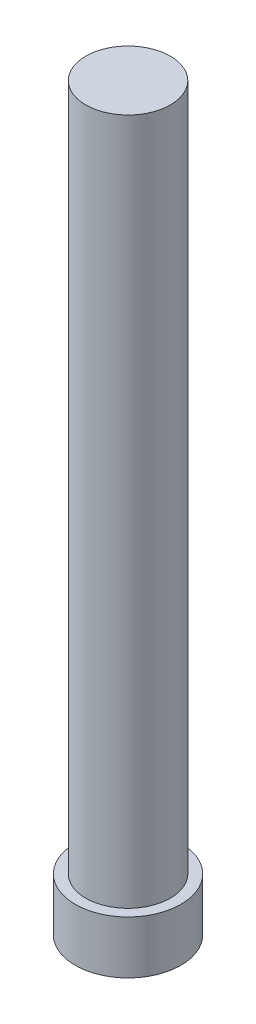
ISO-10303-21;
HEADER;
FILE_DESCRIPTION(('STEP AP214'),'2;1');
FILE_NAME('part.step','',(''),(''),'','','');
FILE_SCHEMA(('AUTOMOTIVE_DESIGN { 1 0 10303 214 1 1 1 1 }'));
ENDSEC;
DATA;
#1=APPLICATION_CONTEXT('core data for automotive mechanical design processes');
#2=APPLICATION_PROTOCOL_DEFINITION('international standard','automotive_design',2000,#1);
#3=PRODUCT_CONTEXT('',#1,'mechanical');
#4=PRODUCT('Part','Part','',(#3));
#5=PRODUCT_RELATED_PRODUCT_CATEGORY('part','',(#4));
#6=PRODUCT_DEFINITION_FORMATION('','',#4);
#7=PRODUCT_DEFINITION_CONTEXT('part definition',#1,'design');
#8=PRODUCT_DEFINITION('design','',#6,#7);
#9=PRODUCT_DEFINITION_SHAPE('','',#8);
#10=(LENGTH_UNIT() NAMED_UNIT(*) SI_UNIT(.MILLI.,.METRE.));
#11=(NAMED_UNIT(*) PLANE_ANGLE_UNIT() SI_UNIT($,.RADIAN.));
#12=(NAMED_UNIT(*) SI_UNIT($,.STERADIAN.) SOLID_ANGLE_UNIT());
#13=UNCERTAINTY_MEASURE_WITH_UNIT(LENGTH_MEASURE(1.E-05),#10,'distance_accuracy_value','');
#14=(GEOMETRIC_REPRESENTATION_CONTEXT(3) GLOBAL_UNCERTAINTY_ASSIGNED_CONTEXT((#13)) GLOBAL_UNIT_ASSIGNED_CONTEXT((#10,
#11,#12)) REPRESENTATION_CONTEXT('',''));
#15=CARTESIAN_POINT('',(0.,0.,0.));
#16=DIRECTION('',(0.,0.,1.));
#17=DIRECTION('',(1.,0.,0.));
#18=AXIS2_PLACEMENT_3D('',#15,#16,#17);
#19=CARTESIAN_POINT('',(0.,65.,0.));
#20=DIRECTION('',(0.,-1.,0.));
#21=DIRECTION('',(0.,0.,-1.));
#22=AXIS2_PLACEMENT_3D('',#19,#20,#21);
#23=CYLINDRICAL_SURFACE('',#22,4.);
#24=CARTESIAN_POINT('',(0.,65.,0.));
#25=DIRECTION('',(0.,1.,0.));
#26=DIRECTION('',(0.,0.,1.));
#27=AXIS2_PLACEMENT_3D('',#24,#25,#26);
#28=CIRCLE('',#27,4.);
#29=CARTESIAN_POINT('',(0.,65.,4.));
#30=VERTEX_POINT('',#29);
#31=EDGE_CURVE('E10',#30,#30,#28,.T.);
#32=ORIENTED_EDGE('',*,*,#31,.F.);
#33=EDGE_LOOP('',(#32));
#34=FACE_BOUND('',#33,.T.);
#35=CARTESIAN_POINT('',(0.,0.,0.));
#36=DIRECTION('',(0.,1.,0.));
#37=DIRECTION('',(0.,0.,1.));
#38=AXIS2_PLACEMENT_3D('',#35,#36,#37);
#39=CIRCLE('',#38,4.);
#40=CARTESIAN_POINT('',(0.,0.,4.));
#41=VERTEX_POINT('',#40);
#42=EDGE_CURVE('E38',#41,#41,#39,.T.);
#43=ORIENTED_EDGE('',*,*,#42,.T.);
#44=EDGE_LOOP('',(#43));
#45=FACE_BOUND('',#44,.T.);
#46=ADVANCED_FACE('F35',(#34,#45),#23,.T.);
#47=CARTESIAN_POINT('',(0.,65.,0.));
#48=DIRECTION('',(0.,1.,0.));
#49=DIRECTION('',(0.,0.,1.));
#50=AXIS2_PLACEMENT_3D('',#47,#48,#49);
#51=PLANE('',#50);
#52=ORIENTED_EDGE('',*,*,#31,.T.);
#53=EDGE_LOOP('',(#52));
#54=FACE_BOUND('',#53,.T.);
#55=ADVANCED_FACE('F58',(#54),#51,.T.);
#56=CARTESIAN_POINT('',(0.,-5.,0.));
#57=DIRECTION('',(0.,1.,0.));
#58=DIRECTION('',(0.,0.,1.));
#59=AXIS2_PLACEMENT_3D('',#56,#57,#58);
#60=CYLINDRICAL_SURFACE('',#59,5.);
#61=CARTESIAN_POINT('',(0.,-5.,0.));
#62=DIRECTION('',(0.,-1.,0.));
#63=DIRECTION('',(0.,0.,-1.));
#64=AXIS2_PLACEMENT_3D('',#61,#62,#63);
#65=CIRCLE('',#64,5.);
#66=CARTESIAN_POINT('',(0.,-5.,-5.));
#67=VERTEX_POINT('',#66);
#68=EDGE_CURVE('E45',#67,#67,#65,.T.);
#69=ORIENTED_EDGE('',*,*,#68,.F.);
#70=EDGE_LOOP('',(#69));
#71=FACE_BOUND('',#70,.T.);
#72=CARTESIAN_POINT('',(0.,0.,0.));
#73=DIRECTION('',(0.,-1.,0.));
#74=DIRECTION('',(0.,0.,-1.));
#75=AXIS2_PLACEMENT_3D('',#72,#73,#74);
#76=CIRCLE('',#75,5.);
#77=CARTESIAN_POINT('',(0.,0.,-5.));
#78=VERTEX_POINT('',#77);
#79=EDGE_CURVE('E47',#78,#78,#76,.T.);
#80=ORIENTED_EDGE('',*,*,#79,.T.);
#81=EDGE_LOOP('',(#80));
#82=FACE_BOUND('',#81,.T.);
#83=ADVANCED_FACE('F55',(#71,#82),#60,.T.);
#84=CARTESIAN_POINT('',(0.,-5.,0.));
#85=DIRECTION('',(0.,-1.,0.));
#86=DIRECTION('',(0.,0.,-1.));
#87=AXIS2_PLACEMENT_3D('',#84,#85,#86);
#88=PLANE('',#87);
#89=ORIENTED_EDGE('',*,*,#68,.T.);
#90=EDGE_LOOP('',(#89));
#91=FACE_BOUND('',#90,.T.);
#92=ADVANCED_FACE('F53',(#91),#88,.T.);
#93=CARTESIAN_POINT('',(0.,0.,0.));
#94=DIRECTION('',(0.,-1.,0.));
#95=DIRECTION('',(0.,0.,-1.));
#96=AXIS2_PLACEMENT_3D('',#93,#94,#95);
#97=PLANE('',#96);
#98=ORIENTED_EDGE('',*,*,#42,.F.);
#99=EDGE_LOOP('',(#98));
#100=FACE_BOUND('',#99,.T.);
#101=ORIENTED_EDGE('',*,*,#79,.F.);
#102=EDGE_LOOP('',(#101));
#103=FACE_BOUND('',#102,.T.);
#104=ADVANCED_FACE('F62',(#100,#103),#97,.F.);
#105=CLOSED_SHELL('',(#46,#55,#83,#92,#104));
#106=MANIFOLD_SOLID_BREP('B2',#105);
#107=ADVANCED_BREP_SHAPE_REPRESENTATION('',(#18,#106),#14);
#108=SHAPE_DEFINITION_REPRESENTATION(#9,#107);
ENDSEC;
END-ISO-10303-21;
